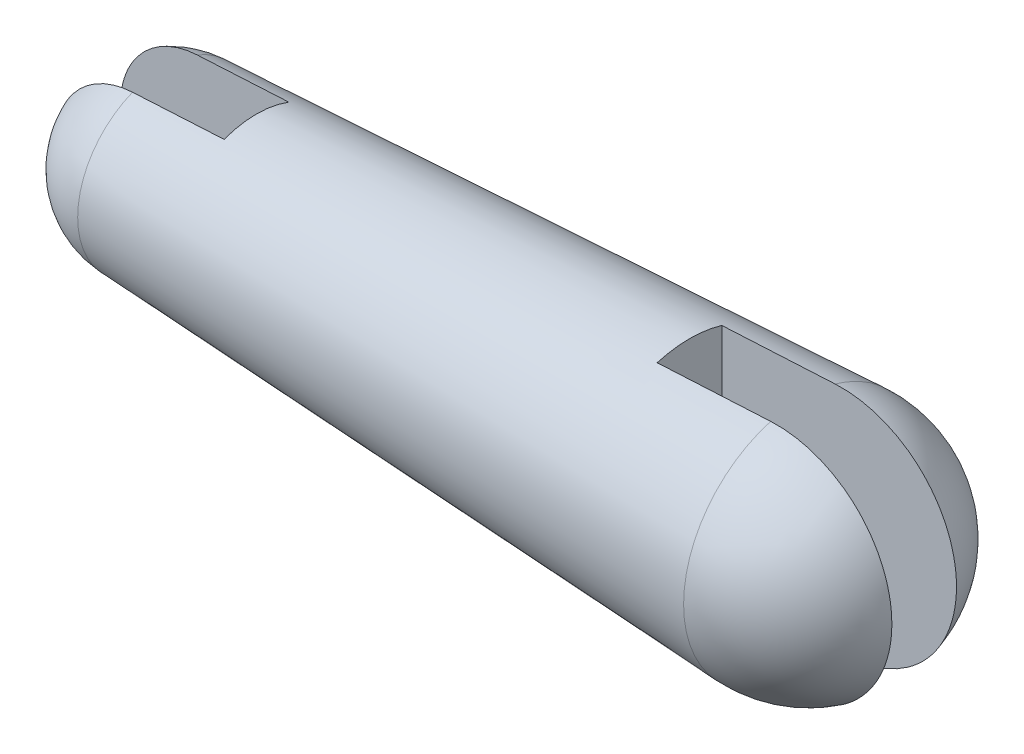
ISO-10303-21;
HEADER;
FILE_DESCRIPTION(('STEP AP214'),'2;1');
FILE_NAME('part.step','',(''),(''),'','','');
FILE_SCHEMA(('AUTOMOTIVE_DESIGN { 1 0 10303 214 1 1 1 1 }'));
ENDSEC;
DATA;
#1=APPLICATION_CONTEXT('core data for automotive mechanical design processes');
#2=APPLICATION_PROTOCOL_DEFINITION('international standard','automotive_design',2000,#1);
#3=PRODUCT_CONTEXT('',#1,'mechanical');
#4=PRODUCT('Part','Part','',(#3));
#5=PRODUCT_RELATED_PRODUCT_CATEGORY('part','',(#4));
#6=PRODUCT_DEFINITION_FORMATION('','',#4);
#7=PRODUCT_DEFINITION_CONTEXT('part definition',#1,'design');
#8=PRODUCT_DEFINITION('design','',#6,#7);
#9=PRODUCT_DEFINITION_SHAPE('','',#8);
#10=(LENGTH_UNIT() NAMED_UNIT(*) SI_UNIT(.MILLI.,.METRE.));
#11=(NAMED_UNIT(*) PLANE_ANGLE_UNIT() SI_UNIT($,.RADIAN.));
#12=(NAMED_UNIT(*) SI_UNIT($,.STERADIAN.) SOLID_ANGLE_UNIT());
#13=UNCERTAINTY_MEASURE_WITH_UNIT(LENGTH_MEASURE(1.E-05),#10,'distance_accuracy_value','');
#14=(GEOMETRIC_REPRESENTATION_CONTEXT(3) GLOBAL_UNCERTAINTY_ASSIGNED_CONTEXT((#13)) GLOBAL_UNIT_ASSIGNED_CONTEXT((#10,
#11,#12)) REPRESENTATION_CONTEXT('',''));
#15=CARTESIAN_POINT('',(0.,0.,0.));
#16=DIRECTION('',(0.,0.,1.));
#17=DIRECTION('',(1.,0.,0.));
#18=AXIS2_PLACEMENT_3D('',#15,#16,#17);
#19=CARTESIAN_POINT('',(-125.73,0.,0.));
#20=DIRECTION('',(-1.,0.,0.));
#21=DIRECTION('',(0.,0.,-1.));
#22=AXIS2_PLACEMENT_3D('',#19,#20,#21);
#23=SPHERICAL_SURFACE('',#22,34.29);
#24=CARTESIAN_POINT('',(-127.461818181818,0.,0.));
#25=DIRECTION('',(-1.,0.,0.));
#26=DIRECTION('',(0.,0.,1.));
#27=AXIS2_PLACEMENT_3D('',#24,#25,#26);
#28=CIRCLE('',#27,34.2462392940469);
#29=CARTESIAN_POINT('',(-127.461818181818,-31.8043221242825,12.7));
#30=VERTEX_POINT('',#29);
#31=CARTESIAN_POINT('',(-127.461818181818,31.8043221242825,12.7));
#32=VERTEX_POINT('',#31);
#33=EDGE_CURVE('E189',#30,#32,#28,.T.);
#34=ORIENTED_EDGE('',*,*,#33,.T.);
#35=CARTESIAN_POINT('',(-125.73,0.,12.7));
#36=DIRECTION('',(0.,0.,1.));
#37=DIRECTION('',(1.,0.,0.));
#38=AXIS2_PLACEMENT_3D('',#35,#36,#37);
#39=CIRCLE('',#38,31.8514379581205);
#40=EDGE_CURVE('E200',#32,#30,#39,.T.);
#41=ORIENTED_EDGE('',*,*,#40,.T.);
#42=EDGE_LOOP('',(#34,#41));
#43=FACE_BOUND('',#42,.T.);
#44=ADVANCED_FACE('F32',(#43),#23,.T.);
#45=CARTESIAN_POINT('',(125.73,0.,0.));
#46=DIRECTION('',(-1.,0.,0.));
#47=DIRECTION('',(0.,0.,-1.));
#48=AXIS2_PLACEMENT_3D('',#45,#46,#47);
#49=SPHERICAL_SURFACE('',#48,46.99);
#50=CARTESIAN_POINT('',(123.356767676768,0.,0.));
#51=DIRECTION('',(-1.,0.,0.));
#52=DIRECTION('',(0.,0.,1.));
#53=AXIS2_PLACEMENT_3D('',#50,#51,#52);
#54=CIRCLE('',#53,46.9300316251754);
#55=CARTESIAN_POINT('',(123.356767676768,-45.1789538207777,12.7));
#56=VERTEX_POINT('',#55);
#57=CARTESIAN_POINT('',(123.356767676768,45.1789538207777,12.7));
#58=VERTEX_POINT('',#57);
#59=EDGE_CURVE('E185',#56,#58,#54,.T.);
#60=ORIENTED_EDGE('',*,*,#59,.F.);
#61=CARTESIAN_POINT('',(125.73,0.,12.7));
#62=DIRECTION('',(0.,0.,1.));
#63=DIRECTION('',(1.,0.,0.));
#64=AXIS2_PLACEMENT_3D('',#61,#62,#63);
#65=CIRCLE('',#64,45.2412433516145);
#66=EDGE_CURVE('E192',#56,#58,#65,.T.);
#67=ORIENTED_EDGE('',*,*,#66,.T.);
#68=EDGE_LOOP('',(#60,#67));
#69=FACE_BOUND('',#68,.T.);
#70=ADVANCED_FACE('F209',(#69),#49,.T.);
#71=CARTESIAN_POINT('',(-127.461818181818,31.8043221242825,-12.7));
#72=VERTEX_POINT('',#71);
#73=CARTESIAN_POINT('',(-127.461818181818,-31.8043221242825,-12.7));
#74=VERTEX_POINT('',#73);
#75=EDGE_CURVE('E188',#72,#74,#28,.T.);
#76=ORIENTED_EDGE('',*,*,#75,.T.);
#77=CARTESIAN_POINT('',(-125.73,0.,-12.7));
#78=DIRECTION('',(0.,0.,-1.));
#79=DIRECTION('',(-1.,0.,0.));
#80=AXIS2_PLACEMENT_3D('',#77,#78,#79);
#81=CIRCLE('',#80,31.8514379581205);
#82=EDGE_CURVE('E103',#74,#72,#81,.T.);
#83=ORIENTED_EDGE('',*,*,#82,.T.);
#84=EDGE_LOOP('',(#76,#83));
#85=FACE_BOUND('',#84,.T.);
#86=ADVANCED_FACE('F34',(#85),#23,.T.);
#87=CARTESIAN_POINT('',(123.356767676768,45.1789538207777,-12.7));
#88=VERTEX_POINT('',#87);
#89=CARTESIAN_POINT('',(123.356767676768,-45.1789538207777,-12.7));
#90=VERTEX_POINT('',#89);
#91=EDGE_CURVE('E184',#88,#90,#54,.T.);
#92=ORIENTED_EDGE('',*,*,#91,.F.);
#93=CARTESIAN_POINT('',(125.73,0.,-12.7));
#94=DIRECTION('',(0.,0.,-1.));
#95=DIRECTION('',(-1.,0.,0.));
#96=AXIS2_PLACEMENT_3D('',#93,#94,#95);
#97=CIRCLE('',#96,45.2412433516145);
#98=EDGE_CURVE('E60',#88,#90,#97,.T.);
#99=ORIENTED_EDGE('',*,*,#98,.T.);
#100=EDGE_LOOP('',(#92,#99));
#101=FACE_BOUND('',#100,.T.);
#102=ADVANCED_FACE('F214',(#101),#49,.T.);
#103=CARTESIAN_POINT('',(123.356767676768,0.,0.));
#104=DIRECTION('',(1.,0.,0.));
#105=DIRECTION('',(0.,0.,-1.));
#106=AXIS2_PLACEMENT_3D('',#103,#104,#105);
#107=CONICAL_SURFACE('',#106,46.9300316251754,0.0505265462327392);
#108=ORIENTED_EDGE('',*,*,#33,.F.);
#109=CARTESIAN_POINT('',(-184.346621158931,-28.6838229164254,12.7));
#110=CARTESIAN_POINT('',(-173.350947500563,-29.2918939860849,12.7));
#111=CARTESIAN_POINT('',(-162.355104114165,-29.8968873211503,12.7));
#112=CARTESIAN_POINT('',(-140.363130037309,-31.101596853054,12.7));
#113=CARTESIAN_POINT('',(-129.366999346899,-31.7013130507755,12.7));
#114=CARTESIAN_POINT('',(-107.374499692454,-32.8963468115255,12.7));
#115=CARTESIAN_POINT('',(-96.3781307284317,-33.4916643747774,12.7));
#116=CARTESIAN_POINT('',(-74.3851870399158,-34.678521447847,12.7));
#117=CARTESIAN_POINT('',(-63.388612315388,-35.2700609570341,12.7));
#118=CARTESIAN_POINT('',(-52.3919530817691,-35.8600216152152,12.7));
#119=B_SPLINE_CURVE_WITH_KNOTS('',3,(#109,#110,#111,#112,#113,#114,#115,#116,#117,#118),
.UNSPECIFIED.,.F.,.F.,(4,2,2,2,4),(0.,33.037421710568,66.074837893049,99.1122523983287,
132.149672418074),.UNSPECIFIED.);
#120=CARTESIAN_POINT('',(-91.44,-33.7579567295354,12.7));
#121=VERTEX_POINT('',#120);
#122=EDGE_CURVE('E11',#30,#121,#119,.T.);
#123=ORIENTED_EDGE('',*,*,#122,.T.);
#124=CARTESIAN_POINT('',(-91.44,0.,0.));
#125=DIRECTION('',(1.,0.,0.));
#126=DIRECTION('',(0.,0.,-1.));
#127=AXIS2_PLACEMENT_3D('',#124,#125,#126);
#128=CIRCLE('',#127,36.0678477671345);
#129=CARTESIAN_POINT('',(-91.44,-33.7579567295354,-12.7));
#130=VERTEX_POINT('',#129);
#131=EDGE_CURVE('E45',#121,#130,#128,.T.);
#132=ORIENTED_EDGE('',*,*,#131,.T.);
#133=CARTESIAN_POINT('',(-52.3919530817691,-35.8600216152151,-12.7));
#134=CARTESIAN_POINT('',(-63.388612315388,-35.2700609570341,-12.7));
#135=CARTESIAN_POINT('',(-74.3851870399158,-34.678521447847,-12.7));
#136=CARTESIAN_POINT('',(-96.3781307284317,-33.4916643747774,-12.7));
#137=CARTESIAN_POINT('',(-107.374499692454,-32.8963468115255,-12.7));
#138=CARTESIAN_POINT('',(-129.366999346899,-31.7013130507754,-12.7));
#139=CARTESIAN_POINT('',(-140.363130037309,-31.101596853054,-12.7));
#140=CARTESIAN_POINT('',(-162.355104114165,-29.8968873211502,-12.7));
#141=CARTESIAN_POINT('',(-173.350947500563,-29.2918939860849,-12.7));
#142=CARTESIAN_POINT('',(-184.346621158931,-28.6838229164254,-12.7));
#143=B_SPLINE_CURVE_WITH_KNOTS('',3,(#133,#134,#135,#136,#137,#138,#139,#140,#141,#142),
.UNSPECIFIED.,.F.,.F.,(4,2,2,2,4),(0.,33.037420019745,66.0748345250248,99.1122507075057,
132.149672418074),.UNSPECIFIED.);
#144=EDGE_CURVE('E100',#130,#74,#143,.T.);
#145=ORIENTED_EDGE('',*,*,#144,.T.);
#146=ORIENTED_EDGE('',*,*,#75,.F.);
#147=CARTESIAN_POINT('',(-184.346621158931,28.6838229164254,-12.7));
#148=CARTESIAN_POINT('',(-173.350947500563,29.2918939860849,-12.7));
#149=CARTESIAN_POINT('',(-162.355104114165,29.8968873211502,-12.7));
#150=CARTESIAN_POINT('',(-140.363130037309,31.101596853054,-12.7));
#151=CARTESIAN_POINT('',(-129.366999346899,31.7013130507755,-12.7));
#152=CARTESIAN_POINT('',(-107.374499692454,32.8963468115255,-12.7));
#153=CARTESIAN_POINT('',(-96.3781307284317,33.4916643747774,-12.7));
#154=CARTESIAN_POINT('',(-74.3851870399158,34.678521447847,-12.7));
#155=CARTESIAN_POINT('',(-63.388612315388,35.2700609570341,-12.7));
#156=CARTESIAN_POINT('',(-52.3919530817691,35.8600216152151,-12.7));
#157=B_SPLINE_CURVE_WITH_KNOTS('',3,(#147,#148,#149,#150,#151,#152,#153,#154,#155,#156),
.UNSPECIFIED.,.F.,.F.,(4,2,2,2,4),(0.,33.037421710568,66.074837893049,99.1122523983287,
132.149672418074),.UNSPECIFIED.);
#158=CARTESIAN_POINT('',(-91.44,33.7579567295355,-12.7));
#159=VERTEX_POINT('',#158);
#160=EDGE_CURVE('E124',#72,#159,#157,.T.);
#161=ORIENTED_EDGE('',*,*,#160,.T.);
#162=CARTESIAN_POINT('',(-91.44,33.7579567295354,12.7));
#163=VERTEX_POINT('',#162);
#164=EDGE_CURVE('E114',#159,#163,#128,.T.);
#165=ORIENTED_EDGE('',*,*,#164,.T.);
#166=CARTESIAN_POINT('',(-52.3919530817691,35.8600216152152,12.7));
#167=CARTESIAN_POINT('',(-63.388612315388,35.2700609570341,12.7));
#168=CARTESIAN_POINT('',(-74.3851870399158,34.678521447847,12.7));
#169=CARTESIAN_POINT('',(-96.3781307284317,33.4916643747774,12.7));
#170=CARTESIAN_POINT('',(-107.374499692454,32.8963468115255,12.7));
#171=CARTESIAN_POINT('',(-129.366999346899,31.7013130507755,12.7));
#172=CARTESIAN_POINT('',(-140.363130037309,31.101596853054,12.7));
#173=CARTESIAN_POINT('',(-162.355104114165,29.8968873211503,12.7));
#174=CARTESIAN_POINT('',(-173.350947500563,29.2918939860849,12.7));
#175=CARTESIAN_POINT('',(-184.346621158931,28.6838229164254,12.7));
#176=B_SPLINE_CURVE_WITH_KNOTS('',3,(#166,#167,#168,#169,#170,#171,#172,#173,#174,#175),
.UNSPECIFIED.,.F.,.F.,(4,2,2,2,4),(0.,33.037420019745,66.0748345250248,99.1122507075057,
132.149672418074),.UNSPECIFIED.);
#177=EDGE_CURVE('E108',#163,#32,#176,.T.);
#178=ORIENTED_EDGE('',*,*,#177,.T.);
#179=EDGE_LOOP('',(#108,#123,#132,#145,#146,#161,#165,#178));
#180=FACE_BOUND('',#179,.T.);
#181=CARTESIAN_POINT('',(78.7399999999999,0.,0.));
#182=DIRECTION('',(-1.,0.,0.));
#183=DIRECTION('',(0.,0.,1.));
#184=AXIS2_PLACEMENT_3D('',#181,#182,#183);
#185=CIRCLE('',#184,44.6737801047343);
#186=CARTESIAN_POINT('',(78.7399999999999,-42.8305571858008,-12.7));
#187=VERTEX_POINT('',#186);
#188=CARTESIAN_POINT('',(78.7399999999999,-42.8305571858008,12.7));
#189=VERTEX_POINT('',#188);
#190=EDGE_CURVE('E128',#187,#189,#185,.T.);
#191=ORIENTED_EDGE('',*,*,#190,.T.);
#192=CARTESIAN_POINT('',(3.49063827901105,-38.8450805523306,12.7));
#193=CARTESIAN_POINT('',(17.817626469084,-39.6073049237346,12.7));
#194=CARTESIAN_POINT('',(32.144726851143,-40.3674174413253,12.7));
#195=CARTESIAN_POINT('',(60.7991202833836,-41.883989568244,12.7));
#196=CARTESIAN_POINT('',(75.1264133335561,-42.6404491777477,12.7));
#197=CARTESIAN_POINT('',(103.781161568065,-44.1502863507254,12.7));
#198=CARTESIAN_POINT('',(118.1086167524,-44.9036639142418,12.7));
#199=CARTESIAN_POINT('',(146.763667884379,-46.4077506815597,12.7));
#200=CARTESIAN_POINT('',(161.091263832031,-47.1584598852331,12.7));
#201=CARTESIAN_POINT('',(175.41891868963,-47.9080417107742,12.7));
#202=B_SPLINE_CURVE_WITH_KNOTS('',3,(#192,#193,#194,#195,#196,#197,#198,#199,#200,#201),
.UNSPECIFIED.,.F.,.F.,(4,2,2,2,4),(0.,43.0417489862224,86.083495901554,129.125242225788,
172.16699061659),.UNSPECIFIED.);
#203=EDGE_CURVE('E126',#189,#56,#202,.T.);
#204=ORIENTED_EDGE('',*,*,#203,.T.);
#205=ORIENTED_EDGE('',*,*,#59,.T.);
#206=CARTESIAN_POINT('',(175.41891868963,47.9080417107742,12.7));
#207=CARTESIAN_POINT('',(161.091263832031,47.1584598852331,12.7));
#208=CARTESIAN_POINT('',(146.763667884379,46.4077506815597,12.7));
#209=CARTESIAN_POINT('',(118.1086167524,44.9036639142418,12.7));
#210=CARTESIAN_POINT('',(103.781161568065,44.1502863507254,12.7));
#211=CARTESIAN_POINT('',(75.1264133335561,42.6404491777477,12.7));
#212=CARTESIAN_POINT('',(60.7991202833837,41.883989568244,12.7));
#213=CARTESIAN_POINT('',(32.144726851143,40.3674174413253,12.7));
#214=CARTESIAN_POINT('',(17.817626469084,39.6073049237346,12.7));
#215=CARTESIAN_POINT('',(3.49063827901105,38.8450805523306,12.7));
#216=B_SPLINE_CURVE_WITH_KNOTS('',3,(#206,#207,#208,#209,#210,#211,#212,#213,#214,#215),
.UNSPECIFIED.,.F.,.F.,(4,2,2,2,4),(0.,43.0417483908015,86.0834947150359,129.125241630367,
172.16699061659),.UNSPECIFIED.);
#217=CARTESIAN_POINT('',(78.7399999999999,42.8305571858008,12.7));
#218=VERTEX_POINT('',#217);
#219=EDGE_CURVE('E163',#58,#218,#216,.T.);
#220=ORIENTED_EDGE('',*,*,#219,.T.);
#221=CARTESIAN_POINT('',(78.7399999999999,42.8305571858008,-12.7));
#222=VERTEX_POINT('',#221);
#223=EDGE_CURVE('E170',#218,#222,#185,.T.);
#224=ORIENTED_EDGE('',*,*,#223,.T.);
#225=CARTESIAN_POINT('',(3.49063827901105,38.8450805523306,-12.7));
#226=CARTESIAN_POINT('',(17.817626469084,39.6073049237346,-12.7));
#227=CARTESIAN_POINT('',(32.144726851143,40.3674174413253,-12.7));
#228=CARTESIAN_POINT('',(60.7991202833836,41.883989568244,-12.7));
#229=CARTESIAN_POINT('',(75.1264133335561,42.6404491777477,-12.7));
#230=CARTESIAN_POINT('',(103.781161568065,44.1502863507254,-12.7));
#231=CARTESIAN_POINT('',(118.1086167524,44.9036639142418,-12.7));
#232=CARTESIAN_POINT('',(146.763667884379,46.4077506815597,-12.7));
#233=CARTESIAN_POINT('',(161.091263832031,47.1584598852331,-12.7));
#234=CARTESIAN_POINT('',(175.41891868963,47.9080417107742,-12.7));
#235=B_SPLINE_CURVE_WITH_KNOTS('',3,(#225,#226,#227,#228,#229,#230,#231,#232,#233,#234),
.UNSPECIFIED.,.F.,.F.,(4,2,2,2,4),(0.,43.0417489862224,86.083495901554,129.125242225788,
172.16699061659),.UNSPECIFIED.);
#236=EDGE_CURVE('E179',#222,#88,#235,.T.);
#237=ORIENTED_EDGE('',*,*,#236,.T.);
#238=ORIENTED_EDGE('',*,*,#91,.T.);
#239=CARTESIAN_POINT('',(175.41891868963,-47.9080417107742,-12.7));
#240=CARTESIAN_POINT('',(161.091263832031,-47.1584598852331,-12.7));
#241=CARTESIAN_POINT('',(146.763667884379,-46.4077506815597,-12.7));
#242=CARTESIAN_POINT('',(118.1086167524,-44.9036639142418,-12.7));
#243=CARTESIAN_POINT('',(103.781161568065,-44.1502863507254,-12.7));
#244=CARTESIAN_POINT('',(75.1264133335561,-42.6404491777477,-12.7));
#245=CARTESIAN_POINT('',(60.7991202833837,-41.883989568244,-12.7));
#246=CARTESIAN_POINT('',(32.144726851143,-40.3674174413253,-12.7));
#247=CARTESIAN_POINT('',(17.817626469084,-39.6073049237346,-12.7));
#248=CARTESIAN_POINT('',(3.49063827901105,-38.8450805523306,-12.7));
#249=B_SPLINE_CURVE_WITH_KNOTS('',3,(#239,#240,#241,#242,#243,#244,#245,#246,#247,#248),
.UNSPECIFIED.,.F.,.F.,(4,2,2,2,4),(0.,43.0417483908015,86.0834947150359,129.125241630367,
172.16699061659),.UNSPECIFIED.);
#250=EDGE_CURVE('E169',#90,#187,#249,.T.);
#251=ORIENTED_EDGE('',*,*,#250,.T.);
#252=EDGE_LOOP('',(#191,#204,#205,#220,#224,#237,#238,#251));
#253=FACE_BOUND('',#252,.T.);
#254=ADVANCED_FACE('F119',(#180,#253),#107,.T.);
#255=CARTESIAN_POINT('',(78.7399999999999,-46.99,12.7));
#256=DIRECTION('',(0.,0.,1.));
#257=DIRECTION('',(1.,0.,0.));
#258=AXIS2_PLACEMENT_3D('',#255,#256,#257);
#259=PLANE('',#258);
#260=DIRECTION('',(0.,1.,0.));
#261=VECTOR('',#260,1.);
#262=CARTESIAN_POINT('',(78.7399999999999,-46.99,12.7));
#263=LINE('',#262,#261);
#264=EDGE_CURVE('E196',#189,#218,#263,.T.);
#265=ORIENTED_EDGE('',*,*,#264,.T.);
#266=ORIENTED_EDGE('',*,*,#219,.F.);
#267=ORIENTED_EDGE('',*,*,#66,.F.);
#268=ORIENTED_EDGE('',*,*,#203,.F.);
#269=EDGE_LOOP('',(#265,#266,#267,#268));
#270=FACE_BOUND('',#269,.T.);
#271=ADVANCED_FACE('F155',(#270),#259,.F.);
#272=CARTESIAN_POINT('',(78.7399999999999,-46.99,-12.7));
#273=DIRECTION('',(-1.,0.,0.));
#274=DIRECTION('',(0.,0.,1.));
#275=AXIS2_PLACEMENT_3D('',#272,#273,#274);
#276=PLANE('',#275);
#277=ORIENTED_EDGE('',*,*,#264,.F.);
#278=ORIENTED_EDGE('',*,*,#190,.F.);
#279=DIRECTION('',(0.,1.,0.));
#280=VECTOR('',#279,1.);
#281=CARTESIAN_POINT('',(78.7399999999999,-46.99,-12.7));
#282=LINE('',#281,#280);
#283=EDGE_CURVE('E197',#187,#222,#282,.T.);
#284=ORIENTED_EDGE('',*,*,#283,.T.);
#285=ORIENTED_EDGE('',*,*,#223,.F.);
#286=EDGE_LOOP('',(#277,#278,#284,#285));
#287=FACE_BOUND('',#286,.T.);
#288=ADVANCED_FACE('F159',(#287),#276,.F.);
#289=CARTESIAN_POINT('',(78.7399999999999,-46.99,-12.7));
#290=DIRECTION('',(0.,0.,-1.));
#291=DIRECTION('',(-1.,0.,0.));
#292=AXIS2_PLACEMENT_3D('',#289,#290,#291);
#293=PLANE('',#292);
#294=ORIENTED_EDGE('',*,*,#98,.F.);
#295=ORIENTED_EDGE('',*,*,#236,.F.);
#296=ORIENTED_EDGE('',*,*,#283,.F.);
#297=ORIENTED_EDGE('',*,*,#250,.F.);
#298=EDGE_LOOP('',(#294,#295,#296,#297));
#299=FACE_BOUND('',#298,.T.);
#300=ADVANCED_FACE('F154',(#299),#293,.F.);
#301=CARTESIAN_POINT('',(-91.44,-46.99,-12.7));
#302=DIRECTION('',(1.,0.,0.));
#303=DIRECTION('',(0.,0.,-1.));
#304=AXIS2_PLACEMENT_3D('',#301,#302,#303);
#305=PLANE('',#304);
#306=DIRECTION('',(0.,1.,0.));
#307=VECTOR('',#306,1.);
#308=CARTESIAN_POINT('',(-91.44,-46.99,-12.7));
#309=LINE('',#308,#307);
#310=EDGE_CURVE('E52',#130,#159,#309,.T.);
#311=ORIENTED_EDGE('',*,*,#310,.F.);
#312=ORIENTED_EDGE('',*,*,#131,.F.);
#313=DIRECTION('',(0.,1.,0.));
#314=VECTOR('',#313,1.);
#315=CARTESIAN_POINT('',(-91.44,-46.99,12.7));
#316=LINE('',#315,#314);
#317=EDGE_CURVE('E116',#121,#163,#316,.T.);
#318=ORIENTED_EDGE('',*,*,#317,.T.);
#319=ORIENTED_EDGE('',*,*,#164,.F.);
#320=EDGE_LOOP('',(#311,#312,#318,#319));
#321=FACE_BOUND('',#320,.T.);
#322=ADVANCED_FACE('F110',(#321),#305,.F.);
#323=CARTESIAN_POINT('',(-160.02,-46.99,12.7));
#324=DIRECTION('',(0.,0.,1.));
#325=DIRECTION('',(1.,0.,0.));
#326=AXIS2_PLACEMENT_3D('',#323,#324,#325);
#327=PLANE('',#326);
#328=ORIENTED_EDGE('',*,*,#40,.F.);
#329=ORIENTED_EDGE('',*,*,#177,.F.);
#330=ORIENTED_EDGE('',*,*,#317,.F.);
#331=ORIENTED_EDGE('',*,*,#122,.F.);
#332=EDGE_LOOP('',(#328,#329,#330,#331));
#333=FACE_BOUND('',#332,.T.);
#334=ADVANCED_FACE('F144',(#333),#327,.F.);
#335=CARTESIAN_POINT('',(-160.02,-46.99,-12.7));
#336=DIRECTION('',(0.,0.,-1.));
#337=DIRECTION('',(-1.,0.,0.));
#338=AXIS2_PLACEMENT_3D('',#335,#336,#337);
#339=PLANE('',#338);
#340=ORIENTED_EDGE('',*,*,#310,.T.);
#341=ORIENTED_EDGE('',*,*,#160,.F.);
#342=ORIENTED_EDGE('',*,*,#82,.F.);
#343=ORIENTED_EDGE('',*,*,#144,.F.);
#344=EDGE_LOOP('',(#340,#341,#342,#343));
#345=FACE_BOUND('',#344,.T.);
#346=ADVANCED_FACE('F101',(#345),#339,.F.);
#347=CLOSED_SHELL('',(#44,#70,#86,#102,#254,#271,#288,#300,#322,#334,#346));
#348=MANIFOLD_SOLID_BREP('B2',#347);
#349=ADVANCED_BREP_SHAPE_REPRESENTATION('',(#18,#348),#14);
#350=SHAPE_DEFINITION_REPRESENTATION(#9,#349);
ENDSEC;
END-ISO-10303-21;
